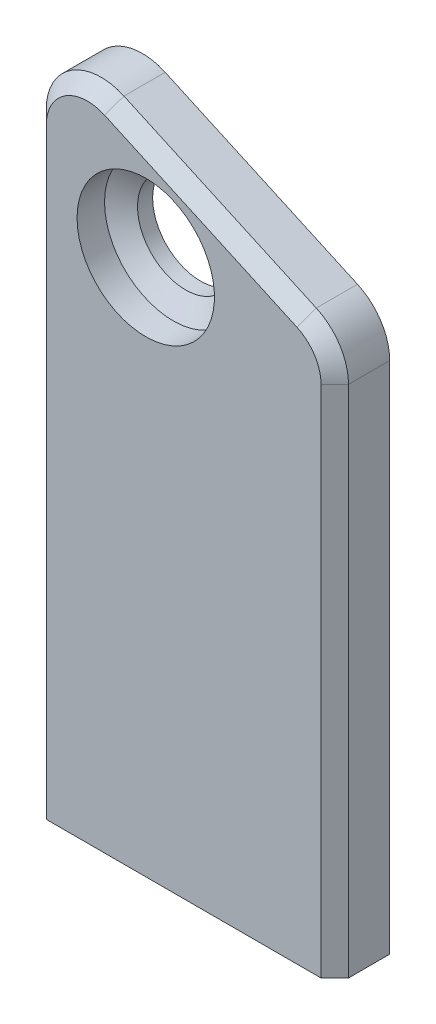
ISO-10303-21;
HEADER;
FILE_DESCRIPTION(('STEP AP214'),'2;1');
FILE_NAME('part.step','',(''),(''),'','','');
FILE_SCHEMA(('AUTOMOTIVE_DESIGN { 1 0 10303 214 1 1 1 1 }'));
ENDSEC;
DATA;
#1=APPLICATION_CONTEXT('core data for automotive mechanical design processes');
#2=APPLICATION_PROTOCOL_DEFINITION('international standard','automotive_design',2000,#1);
#3=PRODUCT_CONTEXT('',#1,'mechanical');
#4=PRODUCT('Part','Part','',(#3));
#5=PRODUCT_RELATED_PRODUCT_CATEGORY('part','',(#4));
#6=PRODUCT_DEFINITION_FORMATION('','',#4);
#7=PRODUCT_DEFINITION_CONTEXT('part definition',#1,'design');
#8=PRODUCT_DEFINITION('design','',#6,#7);
#9=PRODUCT_DEFINITION_SHAPE('','',#8);
#10=(LENGTH_UNIT() NAMED_UNIT(*) SI_UNIT(.MILLI.,.METRE.));
#11=(NAMED_UNIT(*) PLANE_ANGLE_UNIT() SI_UNIT($,.RADIAN.));
#12=(NAMED_UNIT(*) SI_UNIT($,.STERADIAN.) SOLID_ANGLE_UNIT());
#13=UNCERTAINTY_MEASURE_WITH_UNIT(LENGTH_MEASURE(1.E-05),#10,'distance_accuracy_value','');
#14=(GEOMETRIC_REPRESENTATION_CONTEXT(3) GLOBAL_UNCERTAINTY_ASSIGNED_CONTEXT((#13)) GLOBAL_UNIT_ASSIGNED_CONTEXT((#10,
#11,#12)) REPRESENTATION_CONTEXT('',''));
#15=CARTESIAN_POINT('',(0.,0.,0.));
#16=DIRECTION('',(0.,0.,1.));
#17=DIRECTION('',(1.,0.,0.));
#18=AXIS2_PLACEMENT_3D('',#15,#16,#17);
#19=CARTESIAN_POINT('',(0.,50.,-4.));
#20=DIRECTION('',(1.,0.,0.));
#21=DIRECTION('',(0.,1.,0.));
#22=AXIS2_PLACEMENT_3D('',#19,#20,#21);
#23=PLANE('',#22);
#24=DIRECTION('',(0.,0.,1.));
#25=VECTOR('',#24,1.);
#26=CARTESIAN_POINT('',(0.,43.7879832823292,-4.));
#27=LINE('',#26,#25);
#28=CARTESIAN_POINT('',(0.,43.7879832823292,-4.));
#29=VERTEX_POINT('',#28);
#30=CARTESIAN_POINT('',(0.,43.7879832823292,-1.));
#31=VERTEX_POINT('',#30);
#32=EDGE_CURVE('E138',#29,#31,#27,.T.);
#33=ORIENTED_EDGE('',*,*,#32,.F.);
#34=DIRECTION('',(0.,-1.,0.));
#35=VECTOR('',#34,1.);
#36=CARTESIAN_POINT('',(0.,50.,-4.));
#37=LINE('',#36,#35);
#38=CARTESIAN_POINT('',(0.,0.,-4.));
#39=VERTEX_POINT('',#38);
#40=EDGE_CURVE('E117',#29,#39,#37,.T.);
#41=ORIENTED_EDGE('',*,*,#40,.T.);
#42=DIRECTION('',(0.,0.,1.));
#43=VECTOR('',#42,1.);
#44=CARTESIAN_POINT('',(0.,0.,-4.));
#45=LINE('',#44,#43);
#46=CARTESIAN_POINT('',(0.,0.,-1.));
#47=VERTEX_POINT('',#46);
#48=EDGE_CURVE('E126',#39,#47,#45,.T.);
#49=ORIENTED_EDGE('',*,*,#48,.T.);
#50=DIRECTION('',(0.,-1.,0.));
#51=VECTOR('',#50,1.);
#52=CARTESIAN_POINT('',(0.,50.,-1.));
#53=LINE('',#52,#51);
#54=EDGE_CURVE('E165',#31,#47,#53,.T.);
#55=ORIENTED_EDGE('',*,*,#54,.F.);
#56=EDGE_LOOP('',(#33,#41,#49,#55));
#57=FACE_BOUND('',#56,.T.);
#58=ADVANCED_FACE('F39',(#57),#23,.F.);
#59=CARTESIAN_POINT('',(0.,0.,-4.));
#60=DIRECTION('',(0.,1.,0.));
#61=DIRECTION('',(0.,0.,-1.));
#62=AXIS2_PLACEMENT_3D('',#59,#60,#61);
#63=PLANE('',#62);
#64=ORIENTED_EDGE('',*,*,#48,.F.);
#65=DIRECTION('',(1.,0.,0.));
#66=VECTOR('',#65,1.);
#67=CARTESIAN_POINT('',(0.,0.,-4.));
#68=LINE('',#67,#66);
#69=CARTESIAN_POINT('',(22.,0.,-4.));
#70=VERTEX_POINT('',#69);
#71=EDGE_CURVE('E113',#39,#70,#68,.T.);
#72=ORIENTED_EDGE('',*,*,#71,.T.);
#73=DIRECTION('',(0.,0.,1.));
#74=VECTOR('',#73,1.);
#75=CARTESIAN_POINT('',(22.,0.,-4.));
#76=LINE('',#75,#74);
#77=CARTESIAN_POINT('',(22.,0.,-1.));
#78=VERTEX_POINT('',#77);
#79=EDGE_CURVE('E135',#70,#78,#76,.T.);
#80=ORIENTED_EDGE('',*,*,#79,.T.);
#81=DIRECTION('',(-0.70710678118655,0.,0.707106781186545));
#82=VECTOR('',#81,1.);
#83=CARTESIAN_POINT('',(22.,0.,-1.));
#84=LINE('',#83,#82);
#85=CARTESIAN_POINT('',(21.,0.,0.));
#86=VERTEX_POINT('',#85);
#87=EDGE_CURVE('E167',#86,#78,#84,.F.);
#88=ORIENTED_EDGE('',*,*,#87,.F.);
#89=DIRECTION('',(1.,0.,0.));
#90=VECTOR('',#89,1.);
#91=CARTESIAN_POINT('',(0.,0.,0.));
#92=LINE('',#91,#90);
#93=CARTESIAN_POINT('',(1.00000000000001,0.,0.));
#94=VERTEX_POINT('',#93);
#95=EDGE_CURVE('E139',#94,#86,#92,.T.);
#96=ORIENTED_EDGE('',*,*,#95,.F.);
#97=DIRECTION('',(-0.70710678118655,0.,-0.707106781186545));
#98=VECTOR('',#97,1.);
#99=CARTESIAN_POINT('',(0.,0.,-1.));
#100=LINE('',#99,#98);
#101=EDGE_CURVE('E130',#47,#94,#100,.F.);
#102=ORIENTED_EDGE('',*,*,#101,.F.);
#103=EDGE_LOOP('',(#64,#72,#80,#88,#96,#102));
#104=FACE_BOUND('',#103,.T.);
#105=ADVANCED_FACE('F127',(#104),#63,.F.);
#106=CARTESIAN_POINT('',(22.,0.,-4.));
#107=DIRECTION('',(-1.,0.,0.));
#108=DIRECTION('',(0.,0.,-1.));
#109=AXIS2_PLACEMENT_3D('',#106,#107,#108);
#110=PLANE('',#109);
#111=ORIENTED_EDGE('',*,*,#79,.F.);
#112=DIRECTION('',(0.,1.,0.));
#113=VECTOR('',#112,1.);
#114=CARTESIAN_POINT('',(22.,0.,-4.));
#115=LINE('',#114,#113);
#116=CARTESIAN_POINT('',(22.,37.4243469186929,-4.));
#117=VERTEX_POINT('',#116);
#118=EDGE_CURVE('E120',#70,#117,#115,.T.);
#119=ORIENTED_EDGE('',*,*,#118,.T.);
#120=DIRECTION('',(0.,0.,1.));
#121=VECTOR('',#120,1.);
#122=CARTESIAN_POINT('',(22.,37.4243469186929,-4.));
#123=LINE('',#122,#121);
#124=CARTESIAN_POINT('',(22.,37.4243469186929,-1.));
#125=VERTEX_POINT('',#124);
#126=EDGE_CURVE('E157',#125,#117,#123,.F.);
#127=ORIENTED_EDGE('',*,*,#126,.F.);
#128=DIRECTION('',(0.,1.,0.));
#129=VECTOR('',#128,1.);
#130=CARTESIAN_POINT('',(22.,0.,-1.));
#131=LINE('',#130,#129);
#132=EDGE_CURVE('E11',#78,#125,#131,.T.);
#133=ORIENTED_EDGE('',*,*,#132,.F.);
#134=EDGE_LOOP('',(#111,#119,#127,#133));
#135=FACE_BOUND('',#134,.T.);
#136=ADVANCED_FACE('F204',(#135),#110,.F.);
#137=CARTESIAN_POINT('',(22.,40.,-4.));
#138=DIRECTION('',(-0.413802944301184,-0.910366477462605,0.));
#139=DIRECTION('',(0.910366477462605,-0.413802944301184,0.));
#140=AXIS2_PLACEMENT_3D('',#137,#138,#139);
#141=PLANE('',#140);
#142=DIRECTION('',(0.,0.,1.));
#143=VECTOR('',#142,1.);
#144=CARTESIAN_POINT('',(19.6552117772047,41.0658128285433,-4.));
#145=LINE('',#144,#143);
#146=CARTESIAN_POINT('',(19.6552117772047,41.0658128285433,-4.));
#147=VERTEX_POINT('',#146);
#148=CARTESIAN_POINT('',(19.6552117772047,41.0658128285433,-1.));
#149=VERTEX_POINT('',#148);
#150=EDGE_CURVE('E154',#147,#149,#145,.T.);
#151=ORIENTED_EDGE('',*,*,#150,.F.);
#152=DIRECTION('',(-0.910366477462605,0.413802944301184,0.));
#153=VECTOR('',#152,1.);
#154=CARTESIAN_POINT('',(22.,40.,-4.));
#155=LINE('',#154,#153);
#156=CARTESIAN_POINT('',(5.65521177720474,47.4294491921797,-4.));
#157=VERTEX_POINT('',#156);
#158=EDGE_CURVE('E148',#147,#157,#155,.T.);
#159=ORIENTED_EDGE('',*,*,#158,.T.);
#160=DIRECTION('',(0.,0.,1.));
#161=VECTOR('',#160,1.);
#162=CARTESIAN_POINT('',(5.65521177720474,47.4294491921797,-4.));
#163=LINE('',#162,#161);
#164=CARTESIAN_POINT('',(5.65521177720474,47.4294491921797,-1.));
#165=VERTEX_POINT('',#164);
#166=EDGE_CURVE('E134',#165,#157,#163,.F.);
#167=ORIENTED_EDGE('',*,*,#166,.F.);
#168=DIRECTION('',(-0.910366477462605,0.413802944301184,0.));
#169=VECTOR('',#168,1.);
#170=CARTESIAN_POINT('',(22.,40.,-1.));
#171=LINE('',#170,#169);
#172=EDGE_CURVE('E186',#149,#165,#171,.T.);
#173=ORIENTED_EDGE('',*,*,#172,.F.);
#174=EDGE_LOOP('',(#151,#159,#167,#173));
#175=FACE_BOUND('',#174,.T.);
#176=ADVANCED_FACE('F212',(#175),#141,.F.);
#177=CARTESIAN_POINT('',(0.,0.,-4.));
#178=DIRECTION('',(0.,0.,-1.));
#179=DIRECTION('',(1.,0.,0.));
#180=AXIS2_PLACEMENT_3D('',#177,#178,#179);
#181=PLANE('',#180);
#182=CARTESIAN_POINT('',(8.23973067596322,39.04903500839,-4.));
#183=DIRECTION('',(0.,0.,-1.));
#184=DIRECTION('',(-1.,0.,0.));
#185=AXIS2_PLACEMENT_3D('',#182,#183,#184);
#186=CIRCLE('',#185,3.49999999999999);
#187=CARTESIAN_POINT('',(4.73973067596323,39.04903500839,-4.));
#188=VERTEX_POINT('',#187);
#189=EDGE_CURVE('E144',#188,#188,#186,.T.);
#190=ORIENTED_EDGE('',*,*,#189,.F.);
#191=EDGE_LOOP('',(#190));
#192=FACE_BOUND('',#191,.T.);
#193=ORIENTED_EDGE('',*,*,#118,.F.);
#194=ORIENTED_EDGE('',*,*,#71,.F.);
#195=ORIENTED_EDGE('',*,*,#40,.F.);
#196=CARTESIAN_POINT('',(4.,43.7879832823292,-4.));
#197=DIRECTION('',(0.,0.,1.));
#198=DIRECTION('',(1.,0.,0.));
#199=AXIS2_PLACEMENT_3D('',#196,#197,#198);
#200=CIRCLE('',#199,4.);
#201=EDGE_CURVE('E160',#157,#29,#200,.T.);
#202=ORIENTED_EDGE('',*,*,#201,.F.);
#203=ORIENTED_EDGE('',*,*,#158,.F.);
#204=CARTESIAN_POINT('',(18.,37.4243469186929,-4.));
#205=DIRECTION('',(0.,0.,1.));
#206=DIRECTION('',(1.,0.,0.));
#207=AXIS2_PLACEMENT_3D('',#204,#205,#206);
#208=CIRCLE('',#207,4.);
#209=EDGE_CURVE('E162',#117,#147,#208,.T.);
#210=ORIENTED_EDGE('',*,*,#209,.F.);
#211=EDGE_LOOP('',(#193,#194,#195,#202,#203,#210));
#212=FACE_BOUND('',#211,.T.);
#213=ADVANCED_FACE('F115',(#192,#212),#181,.T.);
#214=CARTESIAN_POINT('',(0.,0.,0.));
#215=DIRECTION('',(0.,0.,-1.));
#216=DIRECTION('',(1.,0.,0.));
#217=AXIS2_PLACEMENT_3D('',#214,#215,#216);
#218=PLANE('',#217);
#219=CARTESIAN_POINT('',(8.23973067596322,39.04903500839,0.));
#220=DIRECTION('',(0.,0.,-1.));
#221=DIRECTION('',(-1.,0.,0.));
#222=AXIS2_PLACEMENT_3D('',#219,#220,#221);
#223=CIRCLE('',#222,4.99999999999999);
#224=CARTESIAN_POINT('',(3.23973067596323,39.04903500839,0.));
#225=VERTEX_POINT('',#224);
#226=EDGE_CURVE('E265',#225,#225,#223,.T.);
#227=ORIENTED_EDGE('',*,*,#226,.T.);
#228=EDGE_LOOP('',(#227));
#229=FACE_BOUND('',#228,.T.);
#230=ORIENTED_EDGE('',*,*,#95,.T.);
#231=DIRECTION('',(0.,-1.,0.));
#232=VECTOR('',#231,1.);
#233=CARTESIAN_POINT('',(21.,0.,0.));
#234=LINE('',#233,#232);
#235=CARTESIAN_POINT('',(21.,37.4243469186929,0.));
#236=VERTEX_POINT('',#235);
#237=EDGE_CURVE('E171',#236,#86,#234,.T.);
#238=ORIENTED_EDGE('',*,*,#237,.F.);
#239=CARTESIAN_POINT('',(18.,37.4243469186929,0.));
#240=DIRECTION('',(0.,0.,1.));
#241=DIRECTION('',(1.,0.,0.));
#242=AXIS2_PLACEMENT_3D('',#239,#240,#241);
#243=CIRCLE('',#242,2.99999999999999);
#244=CARTESIAN_POINT('',(19.2414088329035,40.1554463510807,0.));
#245=VERTEX_POINT('',#244);
#246=EDGE_CURVE('E173',#245,#236,#243,.F.);
#247=ORIENTED_EDGE('',*,*,#246,.F.);
#248=DIRECTION('',(0.910366477462605,-0.413802944301184,0.));
#249=VECTOR('',#248,1.);
#250=CARTESIAN_POINT('',(18.421813494055,40.527989686921,0.));
#251=LINE('',#250,#249);
#252=CARTESIAN_POINT('',(5.24140883290355,46.5190827147171,0.));
#253=VERTEX_POINT('',#252);
#254=EDGE_CURVE('E175',#253,#245,#251,.T.);
#255=ORIENTED_EDGE('',*,*,#254,.F.);
#256=CARTESIAN_POINT('',(4.,43.7879832823292,0.));
#257=DIRECTION('',(0.,0.,1.));
#258=DIRECTION('',(1.,0.,0.));
#259=AXIS2_PLACEMENT_3D('',#256,#257,#258);
#260=CIRCLE('',#259,2.99999999999999);
#261=CARTESIAN_POINT('',(1.00000000000001,43.7879832823292,0.));
#262=VERTEX_POINT('',#261);
#263=EDGE_CURVE('E177',#262,#253,#260,.F.);
#264=ORIENTED_EDGE('',*,*,#263,.F.);
#265=DIRECTION('',(0.,1.,0.));
#266=VECTOR('',#265,1.);
#267=CARTESIAN_POINT('',(1.00000000000001,0.,0.));
#268=LINE('',#267,#266);
#269=EDGE_CURVE('E180',#94,#262,#268,.T.);
#270=ORIENTED_EDGE('',*,*,#269,.F.);
#271=EDGE_LOOP('',(#230,#238,#247,#255,#264,#270));
#272=FACE_BOUND('',#271,.T.);
#273=ADVANCED_FACE('F200',(#229,#272),#218,.F.);
#274=CARTESIAN_POINT('',(18.,37.4243469186929,-4.));
#275=DIRECTION('',(0.,0.,1.));
#276=DIRECTION('',(-1.,0.,0.));
#277=AXIS2_PLACEMENT_3D('',#274,#275,#276);
#278=CYLINDRICAL_SURFACE('',#277,4.);
#279=ORIENTED_EDGE('',*,*,#126,.T.);
#280=ORIENTED_EDGE('',*,*,#209,.T.);
#281=ORIENTED_EDGE('',*,*,#150,.T.);
#282=CARTESIAN_POINT('',(18.,37.4243469186929,-1.));
#283=DIRECTION('',(0.,0.,1.));
#284=DIRECTION('',(1.,0.,0.));
#285=AXIS2_PLACEMENT_3D('',#282,#283,#284);
#286=CIRCLE('',#285,4.);
#287=EDGE_CURVE('E48',#125,#149,#286,.T.);
#288=ORIENTED_EDGE('',*,*,#287,.F.);
#289=EDGE_LOOP('',(#279,#280,#281,#288));
#290=FACE_BOUND('',#289,.T.);
#291=ADVANCED_FACE('F206',(#290),#278,.T.);
#292=CARTESIAN_POINT('',(4.,43.7879832823292,-4.));
#293=DIRECTION('',(0.,0.,1.));
#294=DIRECTION('',(-1.,0.,0.));
#295=AXIS2_PLACEMENT_3D('',#292,#293,#294);
#296=CYLINDRICAL_SURFACE('',#295,4.);
#297=ORIENTED_EDGE('',*,*,#166,.T.);
#298=ORIENTED_EDGE('',*,*,#201,.T.);
#299=ORIENTED_EDGE('',*,*,#32,.T.);
#300=CARTESIAN_POINT('',(4.,43.7879832823292,-1.));
#301=DIRECTION('',(0.,0.,1.));
#302=DIRECTION('',(1.,0.,0.));
#303=AXIS2_PLACEMENT_3D('',#300,#301,#302);
#304=CIRCLE('',#303,4.);
#305=EDGE_CURVE('E183',#165,#31,#304,.T.);
#306=ORIENTED_EDGE('',*,*,#305,.F.);
#307=EDGE_LOOP('',(#297,#298,#299,#306));
#308=FACE_BOUND('',#307,.T.);
#309=ADVANCED_FACE('F220',(#308),#296,.T.);
#310=CARTESIAN_POINT('',(22.,0.,-1.));
#311=DIRECTION('',(-0.707106781186545,0.,-0.70710678118655));
#312=DIRECTION('',(0.,1.,0.));
#313=AXIS2_PLACEMENT_3D('',#310,#311,#312);
#314=PLANE('',#313);
#315=ORIENTED_EDGE('',*,*,#87,.T.);
#316=ORIENTED_EDGE('',*,*,#132,.T.);
#317=DIRECTION('',(-0.70710678118655,0.,0.707106781186545));
#318=VECTOR('',#317,1.);
#319=CARTESIAN_POINT('',(22.,37.4243469186929,-1.));
#320=LINE('',#319,#318);
#321=EDGE_CURVE('E56',#125,#236,#320,.T.);
#322=ORIENTED_EDGE('',*,*,#321,.T.);
#323=ORIENTED_EDGE('',*,*,#237,.T.);
#324=EDGE_LOOP('',(#315,#316,#322,#323));
#325=FACE_BOUND('',#324,.T.);
#326=ADVANCED_FACE('F41',(#325),#314,.F.);
#327=CARTESIAN_POINT('',(18.,37.4243469186929,0.));
#328=DIRECTION('',(0.,0.,-1.));
#329=DIRECTION('',(1.,0.,0.));
#330=AXIS2_PLACEMENT_3D('',#327,#328,#329);
#331=CONICAL_SURFACE('',#330,2.99999999999999,0.785398163397452);
#332=ORIENTED_EDGE('',*,*,#321,.F.);
#333=ORIENTED_EDGE('',*,*,#287,.T.);
#334=DIRECTION('',(-0.292602867990327,-0.643726309578721,0.707106781186544));
#335=VECTOR('',#334,1.);
#336=CARTESIAN_POINT('',(19.6552117772047,41.0658128285433,-1.));
#337=LINE('',#336,#335);
#338=EDGE_CURVE('E64',#149,#245,#337,.T.);
#339=ORIENTED_EDGE('',*,*,#338,.T.);
#340=ORIENTED_EDGE('',*,*,#246,.T.);
#341=EDGE_LOOP('',(#332,#333,#339,#340));
#342=FACE_BOUND('',#341,.T.);
#343=ADVANCED_FACE('F197',(#342),#331,.T.);
#344=CARTESIAN_POINT('',(22.,40.,-1.));
#345=DIRECTION('',(-0.292602867990326,-0.643726309578716,-0.707106781186549));
#346=DIRECTION('',(-0.910366477462605,0.413802944301184,0.));
#347=AXIS2_PLACEMENT_3D('',#344,#345,#346);
#348=PLANE('',#347);
#349=ORIENTED_EDGE('',*,*,#338,.F.);
#350=ORIENTED_EDGE('',*,*,#172,.T.);
#351=DIRECTION('',(-0.292602867990327,-0.643726309578721,0.707106781186544));
#352=VECTOR('',#351,1.);
#353=CARTESIAN_POINT('',(5.65521177720474,47.4294491921797,-1.));
#354=LINE('',#353,#352);
#355=EDGE_CURVE('E191',#165,#253,#354,.T.);
#356=ORIENTED_EDGE('',*,*,#355,.T.);
#357=ORIENTED_EDGE('',*,*,#254,.T.);
#358=EDGE_LOOP('',(#349,#350,#356,#357));
#359=FACE_BOUND('',#358,.T.);
#360=ADVANCED_FACE('F213',(#359),#348,.F.);
#361=CARTESIAN_POINT('',(4.,43.7879832823292,0.));
#362=DIRECTION('',(0.,0.,-1.));
#363=DIRECTION('',(1.,0.,0.));
#364=AXIS2_PLACEMENT_3D('',#361,#362,#363);
#365=CONICAL_SURFACE('',#364,2.99999999999999,0.785398163397452);
#366=ORIENTED_EDGE('',*,*,#355,.F.);
#367=ORIENTED_EDGE('',*,*,#305,.T.);
#368=DIRECTION('',(0.70710678118655,0.,0.707106781186545));
#369=VECTOR('',#368,1.);
#370=CARTESIAN_POINT('',(0.,43.7879832823292,-1.));
#371=LINE('',#370,#369);
#372=EDGE_CURVE('E189',#31,#262,#371,.T.);
#373=ORIENTED_EDGE('',*,*,#372,.T.);
#374=ORIENTED_EDGE('',*,*,#263,.T.);
#375=EDGE_LOOP('',(#366,#367,#373,#374));
#376=FACE_BOUND('',#375,.T.);
#377=ADVANCED_FACE('F216',(#376),#365,.T.);
#378=CARTESIAN_POINT('',(0.,50.,-1.));
#379=DIRECTION('',(0.707106781186545,0.,-0.70710678118655));
#380=DIRECTION('',(0.,-1.,0.));
#381=AXIS2_PLACEMENT_3D('',#378,#379,#380);
#382=PLANE('',#381);
#383=ORIENTED_EDGE('',*,*,#372,.F.);
#384=ORIENTED_EDGE('',*,*,#54,.T.);
#385=ORIENTED_EDGE('',*,*,#101,.T.);
#386=ORIENTED_EDGE('',*,*,#269,.T.);
#387=EDGE_LOOP('',(#383,#384,#385,#386));
#388=FACE_BOUND('',#387,.T.);
#389=ADVANCED_FACE('F218',(#388),#382,.F.);
#390=CARTESIAN_POINT('',(8.23973067596322,39.04903500839,0.));
#391=DIRECTION('',(0.,0.,1.));
#392=DIRECTION('',(-1.,0.,0.));
#393=AXIS2_PLACEMENT_3D('',#390,#391,#392);
#394=CYLINDRICAL_SURFACE('',#393,3.49999999999999);
#395=CARTESIAN_POINT('',(8.23973067596322,39.04903500839,-2.90129092854135));
#396=DIRECTION('',(0.,0.,-1.));
#397=DIRECTION('',(-1.,0.,0.));
#398=AXIS2_PLACEMENT_3D('',#395,#396,#397);
#399=CIRCLE('',#398,3.49999999999999);
#400=CARTESIAN_POINT('',(4.73973067596323,39.04903500839,-2.90129092854135));
#401=VERTEX_POINT('',#400);
#402=EDGE_CURVE('E43',#401,#401,#399,.T.);
#403=ORIENTED_EDGE('',*,*,#402,.F.);
#404=EDGE_LOOP('',(#403));
#405=FACE_BOUND('',#404,.T.);
#406=ORIENTED_EDGE('',*,*,#189,.T.);
#407=EDGE_LOOP('',(#406));
#408=FACE_BOUND('',#407,.T.);
#409=ADVANCED_FACE('F246',(#405,#408),#394,.F.);
#410=CARTESIAN_POINT('',(8.23973067596322,39.04903500839,-2.));
#411=DIRECTION('',(0.,0.,1.));
#412=DIRECTION('',(-1.,0.,0.));
#413=AXIS2_PLACEMENT_3D('',#410,#411,#412);
#414=CONICAL_SURFACE('',#413,5.,1.02974425867665);
#415=CARTESIAN_POINT('',(8.23973067596322,39.04903500839,-2.));
#416=DIRECTION('',(0.,0.,-1.));
#417=DIRECTION('',(-1.,0.,0.));
#418=AXIS2_PLACEMENT_3D('',#415,#416,#417);
#419=CIRCLE('',#418,5.);
#420=CARTESIAN_POINT('',(3.23973067596322,39.04903500839,-2.));
#421=VERTEX_POINT('',#420);
#422=EDGE_CURVE('E262',#421,#421,#419,.T.);
#423=ORIENTED_EDGE('',*,*,#422,.F.);
#424=EDGE_LOOP('',(#423));
#425=FACE_BOUND('',#424,.T.);
#426=ORIENTED_EDGE('',*,*,#402,.T.);
#427=EDGE_LOOP('',(#426));
#428=FACE_BOUND('',#427,.T.);
#429=ADVANCED_FACE('F249',(#425,#428),#414,.F.);
#430=CARTESIAN_POINT('',(8.23973067596322,39.04903500839,0.));
#431=DIRECTION('',(0.,0.,1.));
#432=DIRECTION('',(-1.,0.,0.));
#433=AXIS2_PLACEMENT_3D('',#430,#431,#432);
#434=CYLINDRICAL_SURFACE('',#433,4.99999999999999);
#435=ORIENTED_EDGE('',*,*,#422,.T.);
#436=EDGE_LOOP('',(#435));
#437=FACE_BOUND('',#436,.T.);
#438=ORIENTED_EDGE('',*,*,#226,.F.);
#439=EDGE_LOOP('',(#438));
#440=FACE_BOUND('',#439,.T.);
#441=ADVANCED_FACE('F253',(#437,#440),#434,.F.);
#442=CLOSED_SHELL('',(#58,#105,#136,#176,#213,#273,#291,#309,#326,#343,#360,#377,#389,#409,#429,#441));
#443=MANIFOLD_SOLID_BREP('B2',#442);
#444=ADVANCED_BREP_SHAPE_REPRESENTATION('',(#18,#443),#14);
#445=SHAPE_DEFINITION_REPRESENTATION(#9,#444);
ENDSEC;
END-ISO-10303-21;
